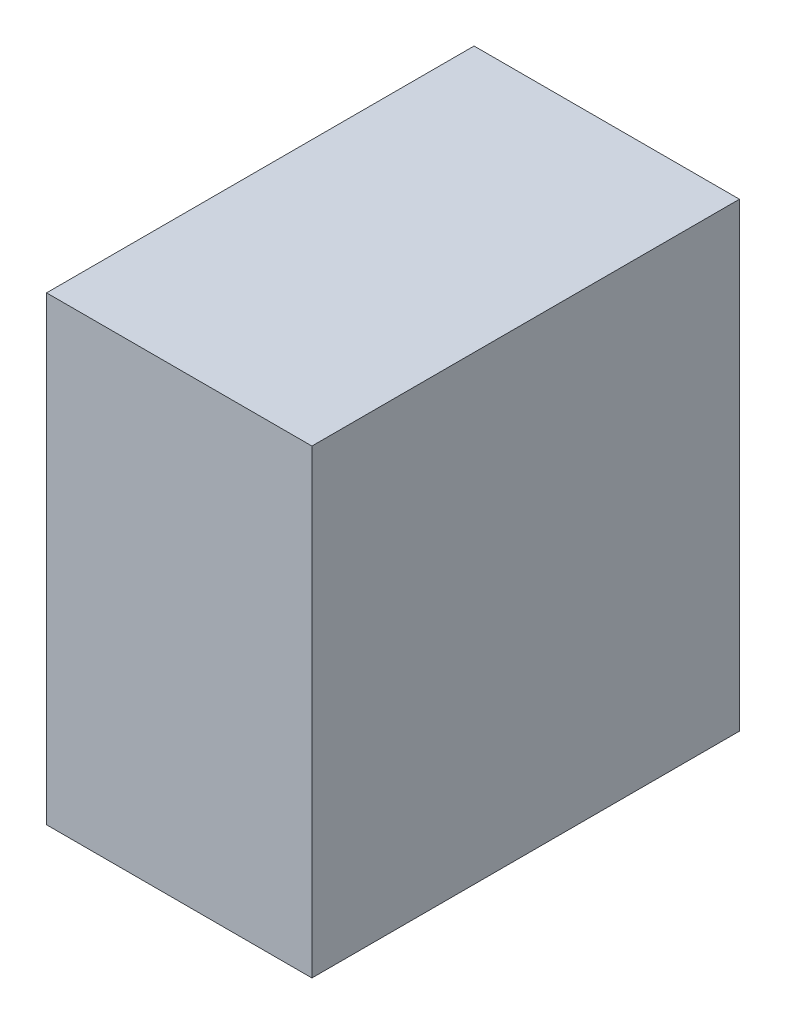
ISO-10303-21;
HEADER;
FILE_DESCRIPTION(('STEP AP214'),'2;1');
FILE_NAME('part.step','',(''),(''),'','','');
FILE_SCHEMA(('AUTOMOTIVE_DESIGN { 1 0 10303 214 1 1 1 1 }'));
ENDSEC;
DATA;
#1=APPLICATION_CONTEXT('core data for automotive mechanical design processes');
#2=APPLICATION_PROTOCOL_DEFINITION('international standard','automotive_design',2000,#1);
#3=PRODUCT_CONTEXT('',#1,'mechanical');
#4=PRODUCT('Part','Part','',(#3));
#5=PRODUCT_RELATED_PRODUCT_CATEGORY('part','',(#4));
#6=PRODUCT_DEFINITION_FORMATION('','',#4);
#7=PRODUCT_DEFINITION_CONTEXT('part definition',#1,'design');
#8=PRODUCT_DEFINITION('design','',#6,#7);
#9=PRODUCT_DEFINITION_SHAPE('','',#8);
#10=(LENGTH_UNIT() NAMED_UNIT(*) SI_UNIT(.MILLI.,.METRE.));
#11=(NAMED_UNIT(*) PLANE_ANGLE_UNIT() SI_UNIT($,.RADIAN.));
#12=(NAMED_UNIT(*) SI_UNIT($,.STERADIAN.) SOLID_ANGLE_UNIT());
#13=UNCERTAINTY_MEASURE_WITH_UNIT(LENGTH_MEASURE(1.E-05),#10,'distance_accuracy_value','');
#14=(GEOMETRIC_REPRESENTATION_CONTEXT(3) GLOBAL_UNCERTAINTY_ASSIGNED_CONTEXT((#13)) GLOBAL_UNIT_ASSIGNED_CONTEXT((#10,
#11,#12)) REPRESENTATION_CONTEXT('',''));
#15=CARTESIAN_POINT('',(0.,0.,0.));
#16=DIRECTION('',(0.,0.,1.));
#17=DIRECTION('',(1.,0.,0.));
#18=AXIS2_PLACEMENT_3D('',#15,#16,#17);
#19=CARTESIAN_POINT('',(180.,625.,-290.));
#20=DIRECTION('',(-1.,0.,0.));
#21=DIRECTION('',(0.,0.,1.));
#22=AXIS2_PLACEMENT_3D('',#19,#20,#21);
#23=PLANE('',#22);
#24=DIRECTION('',(0.,0.,-1.));
#25=VECTOR('',#24,1.);
#26=CARTESIAN_POINT('',(180.,0.,-290.));
#27=LINE('',#26,#25);
#28=CARTESIAN_POINT('',(180.,0.,290.));
#29=VERTEX_POINT('',#28);
#30=CARTESIAN_POINT('',(180.,0.,-290.));
#31=VERTEX_POINT('',#30);
#32=EDGE_CURVE('E100',#29,#31,#27,.T.);
#33=ORIENTED_EDGE('',*,*,#32,.T.);
#34=DIRECTION('',(0.,-1.,0.));
#35=VECTOR('',#34,1.);
#36=CARTESIAN_POINT('',(180.,625.,-290.));
#37=LINE('',#36,#35);
#38=CARTESIAN_POINT('',(180.,625.,-290.));
#39=VERTEX_POINT('',#38);
#40=EDGE_CURVE('E11',#39,#31,#37,.T.);
#41=ORIENTED_EDGE('',*,*,#40,.F.);
#42=DIRECTION('',(0.,0.,-1.));
#43=VECTOR('',#42,1.);
#44=CARTESIAN_POINT('',(180.,625.,-290.));
#45=LINE('',#44,#43);
#46=CARTESIAN_POINT('',(180.,625.,290.));
#47=VERTEX_POINT('',#46);
#48=EDGE_CURVE('E88',#47,#39,#45,.T.);
#49=ORIENTED_EDGE('',*,*,#48,.F.);
#50=DIRECTION('',(0.,-1.,0.));
#51=VECTOR('',#50,1.);
#52=CARTESIAN_POINT('',(180.,625.,290.));
#53=LINE('',#52,#51);
#54=EDGE_CURVE('E96',#47,#29,#53,.T.);
#55=ORIENTED_EDGE('',*,*,#54,.T.);
#56=EDGE_LOOP('',(#33,#41,#49,#55));
#57=FACE_BOUND('',#56,.T.);
#58=ADVANCED_FACE('F37',(#57),#23,.F.);
#59=CARTESIAN_POINT('',(-180.,625.,-290.));
#60=DIRECTION('',(0.,0.,1.));
#61=DIRECTION('',(1.,0.,0.));
#62=AXIS2_PLACEMENT_3D('',#59,#60,#61);
#63=PLANE('',#62);
#64=DIRECTION('',(-1.,0.,0.));
#65=VECTOR('',#64,1.);
#66=CARTESIAN_POINT('',(-180.,0.,-290.));
#67=LINE('',#66,#65);
#68=CARTESIAN_POINT('',(-180.,0.,-290.));
#69=VERTEX_POINT('',#68);
#70=EDGE_CURVE('E92',#31,#69,#67,.T.);
#71=ORIENTED_EDGE('',*,*,#70,.T.);
#72=DIRECTION('',(0.,-1.,0.));
#73=VECTOR('',#72,1.);
#74=CARTESIAN_POINT('',(-180.,625.,-290.));
#75=LINE('',#74,#73);
#76=CARTESIAN_POINT('',(-180.,625.,-290.));
#77=VERTEX_POINT('',#76);
#78=EDGE_CURVE('E45',#77,#69,#75,.T.);
#79=ORIENTED_EDGE('',*,*,#78,.F.);
#80=DIRECTION('',(-1.,0.,0.));
#81=VECTOR('',#80,1.);
#82=CARTESIAN_POINT('',(-180.,625.,-290.));
#83=LINE('',#82,#81);
#84=EDGE_CURVE('E83',#39,#77,#83,.T.);
#85=ORIENTED_EDGE('',*,*,#84,.F.);
#86=ORIENTED_EDGE('',*,*,#40,.T.);
#87=EDGE_LOOP('',(#71,#79,#85,#86));
#88=FACE_BOUND('',#87,.T.);
#89=ADVANCED_FACE('F91',(#88),#63,.F.);
#90=CARTESIAN_POINT('',(-180.,625.,-290.));
#91=DIRECTION('',(1.,0.,0.));
#92=DIRECTION('',(0.,0.,-1.));
#93=AXIS2_PLACEMENT_3D('',#90,#91,#92);
#94=PLANE('',#93);
#95=DIRECTION('',(0.,0.,1.));
#96=VECTOR('',#95,1.);
#97=CARTESIAN_POINT('',(-180.,0.,-290.));
#98=LINE('',#97,#96);
#99=CARTESIAN_POINT('',(-180.,0.,290.));
#100=VERTEX_POINT('',#99);
#101=EDGE_CURVE('E70',#69,#100,#98,.T.);
#102=ORIENTED_EDGE('',*,*,#101,.T.);
#103=DIRECTION('',(0.,-1.,0.));
#104=VECTOR('',#103,1.);
#105=CARTESIAN_POINT('',(-180.,625.,290.));
#106=LINE('',#105,#104);
#107=CARTESIAN_POINT('',(-180.,625.,290.));
#108=VERTEX_POINT('',#107);
#109=EDGE_CURVE('E93',#108,#100,#106,.T.);
#110=ORIENTED_EDGE('',*,*,#109,.F.);
#111=DIRECTION('',(0.,0.,1.));
#112=VECTOR('',#111,1.);
#113=CARTESIAN_POINT('',(-180.,625.,-290.));
#114=LINE('',#113,#112);
#115=EDGE_CURVE('E86',#77,#108,#114,.T.);
#116=ORIENTED_EDGE('',*,*,#115,.F.);
#117=ORIENTED_EDGE('',*,*,#78,.T.);
#118=EDGE_LOOP('',(#102,#110,#116,#117));
#119=FACE_BOUND('',#118,.T.);
#120=ADVANCED_FACE('F94',(#119),#94,.F.);
#121=CARTESIAN_POINT('',(-180.,625.,290.));
#122=DIRECTION('',(0.,0.,-1.));
#123=DIRECTION('',(-1.,0.,0.));
#124=AXIS2_PLACEMENT_3D('',#121,#122,#123);
#125=PLANE('',#124);
#126=DIRECTION('',(1.,0.,0.));
#127=VECTOR('',#126,1.);
#128=CARTESIAN_POINT('',(-180.,0.,290.));
#129=LINE('',#128,#127);
#130=EDGE_CURVE('E76',#100,#29,#129,.T.);
#131=ORIENTED_EDGE('',*,*,#130,.T.);
#132=ORIENTED_EDGE('',*,*,#54,.F.);
#133=DIRECTION('',(1.,0.,0.));
#134=VECTOR('',#133,1.);
#135=CARTESIAN_POINT('',(-180.,625.,290.));
#136=LINE('',#135,#134);
#137=EDGE_CURVE('E53',#108,#47,#136,.T.);
#138=ORIENTED_EDGE('',*,*,#137,.F.);
#139=ORIENTED_EDGE('',*,*,#109,.T.);
#140=EDGE_LOOP('',(#131,#132,#138,#139));
#141=FACE_BOUND('',#140,.T.);
#142=ADVANCED_FACE('F107',(#141),#125,.F.);
#143=CARTESIAN_POINT('',(0.,625.,0.));
#144=DIRECTION('',(0.,1.,0.));
#145=DIRECTION('',(0.,0.,1.));
#146=AXIS2_PLACEMENT_3D('',#143,#144,#145);
#147=PLANE('',#146);
#148=ORIENTED_EDGE('',*,*,#48,.T.);
#149=ORIENTED_EDGE('',*,*,#84,.T.);
#150=ORIENTED_EDGE('',*,*,#115,.T.);
#151=ORIENTED_EDGE('',*,*,#137,.T.);
#152=EDGE_LOOP('',(#148,#149,#150,#151));
#153=FACE_BOUND('',#152,.T.);
#154=ADVANCED_FACE('F84',(#153),#147,.T.);
#155=CARTESIAN_POINT('',(0.,0.,0.));
#156=DIRECTION('',(0.,1.,0.));
#157=DIRECTION('',(0.,0.,1.));
#158=AXIS2_PLACEMENT_3D('',#155,#156,#157);
#159=PLANE('',#158);
#160=ORIENTED_EDGE('',*,*,#32,.F.);
#161=ORIENTED_EDGE('',*,*,#130,.F.);
#162=ORIENTED_EDGE('',*,*,#101,.F.);
#163=ORIENTED_EDGE('',*,*,#70,.F.);
#164=EDGE_LOOP('',(#160,#161,#162,#163));
#165=FACE_BOUND('',#164,.T.);
#166=ADVANCED_FACE('F110',(#165),#159,.F.);
#167=CLOSED_SHELL('',(#58,#89,#120,#142,#154,#166));
#168=MANIFOLD_SOLID_BREP('B2',#167);
#169=ADVANCED_BREP_SHAPE_REPRESENTATION('',(#18,#168),#14);
#170=SHAPE_DEFINITION_REPRESENTATION(#9,#169);
ENDSEC;
END-ISO-10303-21;
